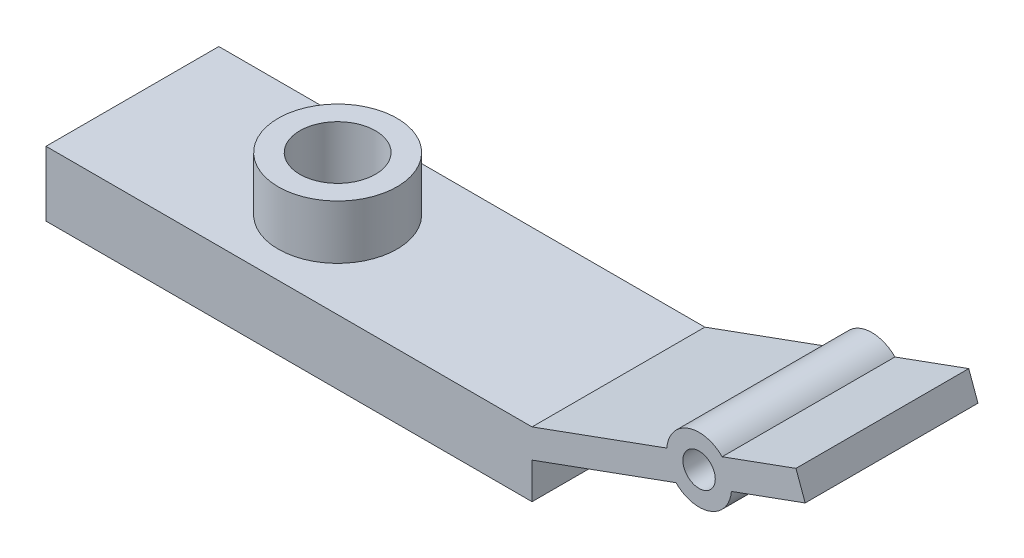
ISO-10303-21;
HEADER;
FILE_DESCRIPTION(('STEP AP214'),'2;1');
FILE_NAME('part.step','',(''),(''),'','','');
FILE_SCHEMA(('AUTOMOTIVE_DESIGN { 1 0 10303 214 1 1 1 1 }'));
ENDSEC;
DATA;
#1=APPLICATION_CONTEXT('core data for automotive mechanical design processes');
#2=APPLICATION_PROTOCOL_DEFINITION('international standard','automotive_design',2000,#1);
#3=PRODUCT_CONTEXT('',#1,'mechanical');
#4=PRODUCT('Part','Part','',(#3));
#5=PRODUCT_RELATED_PRODUCT_CATEGORY('part','',(#4));
#6=PRODUCT_DEFINITION_FORMATION('','',#4);
#7=PRODUCT_DEFINITION_CONTEXT('part definition',#1,'design');
#8=PRODUCT_DEFINITION('design','',#6,#7);
#9=PRODUCT_DEFINITION_SHAPE('','',#8);
#10=(LENGTH_UNIT() NAMED_UNIT(*) SI_UNIT(.MILLI.,.METRE.));
#11=(NAMED_UNIT(*) PLANE_ANGLE_UNIT() SI_UNIT($,.RADIAN.));
#12=(NAMED_UNIT(*) SI_UNIT($,.STERADIAN.) SOLID_ANGLE_UNIT());
#13=UNCERTAINTY_MEASURE_WITH_UNIT(LENGTH_MEASURE(1.E-05),#10,'distance_accuracy_value','');
#14=(GEOMETRIC_REPRESENTATION_CONTEXT(3) GLOBAL_UNCERTAINTY_ASSIGNED_CONTEXT((#13)) GLOBAL_UNIT_ASSIGNED_CONTEXT((#10,
#11,#12)) REPRESENTATION_CONTEXT('',''));
#15=CARTESIAN_POINT('',(0.,0.,0.));
#16=DIRECTION('',(0.,0.,1.));
#17=DIRECTION('',(1.,0.,0.));
#18=AXIS2_PLACEMENT_3D('',#15,#16,#17);
#19=CARTESIAN_POINT('',(120.925214223463,20.5954130344567,32.));
#20=DIRECTION('',(0.,0.,-1.));
#21=DIRECTION('',(-1.,0.,0.));
#22=AXIS2_PLACEMENT_3D('',#19,#20,#21);
#23=CYLINDRICAL_SURFACE('',#22,6.00000000000001);
#24=CARTESIAN_POINT('',(120.925214223463,20.5954130344567,0.));
#25=DIRECTION('',(0.,0.,1.));
#26=DIRECTION('',(1.,0.,0.));
#27=AXIS2_PLACEMENT_3D('',#24,#25,#26);
#28=CIRCLE('',#27,6.00000000000001);
#29=CARTESIAN_POINT('',(116.654846443577,16.3806818420188,0.));
#30=VERTEX_POINT('',#29);
#31=CARTESIAN_POINT('',(126.905682719978,20.111681122965,0.));
#32=VERTEX_POINT('',#31);
#33=EDGE_CURVE('E152',#30,#32,#28,.T.);
#34=ORIENTED_EDGE('',*,*,#33,.T.);
#35=DIRECTION('',(0.,0.,-1.));
#36=VECTOR('',#35,1.);
#37=CARTESIAN_POINT('',(126.905682719978,20.111681122965,32.));
#38=LINE('',#37,#36);
#39=CARTESIAN_POINT('',(126.905682719978,20.111681122965,32.));
#40=VERTEX_POINT('',#39);
#41=EDGE_CURVE('E11',#40,#32,#38,.T.);
#42=ORIENTED_EDGE('',*,*,#41,.F.);
#43=CARTESIAN_POINT('',(120.925214223463,20.5954130344567,32.));
#44=DIRECTION('',(0.,0.,1.));
#45=DIRECTION('',(1.,0.,0.));
#46=AXIS2_PLACEMENT_3D('',#43,#44,#45);
#47=CIRCLE('',#46,6.00000000000001);
#48=CARTESIAN_POINT('',(116.654846443577,16.3806818420188,32.));
#49=VERTEX_POINT('',#48);
#50=EDGE_CURVE('E99',#49,#40,#47,.T.);
#51=ORIENTED_EDGE('',*,*,#50,.F.);
#52=DIRECTION('',(0.,0.,-1.));
#53=VECTOR('',#52,1.);
#54=CARTESIAN_POINT('',(116.654846443577,16.3806818420188,32.));
#55=LINE('',#54,#53);
#56=EDGE_CURVE('E52',#49,#30,#55,.T.);
#57=ORIENTED_EDGE('',*,*,#56,.T.);
#58=EDGE_LOOP('',(#34,#42,#51,#57));
#59=FACE_BOUND('',#58,.T.);
#60=ADVANCED_FACE('F35',(#59),#23,.T.);
#61=CARTESIAN_POINT('',(8.38137511815517,-23.0276388811101,32.));
#62=DIRECTION('',(0.34202014332567,-0.939692620785908,0.));
#63=DIRECTION('',(0.939692620785908,0.34202014332567,0.));
#64=AXIS2_PLACEMENT_3D('',#61,#62,#63);
#65=PLANE('',#64);
#66=DIRECTION('',(-0.939692620785908,-0.34202014332567,0.));
#67=VECTOR('',#66,1.);
#68=CARTESIAN_POINT('',(8.38137511815517,-23.0276388811101,0.));
#69=LINE('',#68,#67);
#70=CARTESIAN_POINT('',(140.574116997496,25.0865843490053,0.));
#71=VERTEX_POINT('',#70);
#72=EDGE_CURVE('E155',#71,#32,#69,.T.);
#73=ORIENTED_EDGE('',*,*,#72,.F.);
#74=DIRECTION('',(0.,0.,-1.));
#75=VECTOR('',#74,1.);
#76=CARTESIAN_POINT('',(140.574116997496,25.0865843490053,32.));
#77=LINE('',#76,#75);
#78=CARTESIAN_POINT('',(140.574116997496,25.0865843490053,32.));
#79=VERTEX_POINT('',#78);
#80=EDGE_CURVE('E44',#79,#71,#77,.T.);
#81=ORIENTED_EDGE('',*,*,#80,.F.);
#82=DIRECTION('',(-0.939692620785908,-0.34202014332567,0.));
#83=VECTOR('',#82,1.);
#84=CARTESIAN_POINT('',(8.38137511815517,-23.0276388811101,32.));
#85=LINE('',#84,#83);
#86=EDGE_CURVE('E214',#79,#40,#85,.T.);
#87=ORIENTED_EDGE('',*,*,#86,.T.);
#88=ORIENTED_EDGE('',*,*,#41,.T.);
#89=EDGE_LOOP('',(#73,#81,#87,#88));
#90=FACE_BOUND('',#89,.T.);
#91=ADVANCED_FACE('F202',(#90),#65,.T.);
#92=CARTESIAN_POINT('',(132.19274187934,48.1142232301155,32.));
#93=DIRECTION('',(0.939692620785907,0.342020143325672,0.));
#94=DIRECTION('',(-0.342020143325672,0.939692620785907,0.));
#95=AXIS2_PLACEMENT_3D('',#92,#93,#94);
#96=PLANE('',#95);
#97=DIRECTION('',(0.342020143325672,-0.939692620785907,0.));
#98=VECTOR('',#97,1.);
#99=CARTESIAN_POINT('',(132.19274187934,48.1142232301155,0.));
#100=LINE('',#99,#98);
#101=CARTESIAN_POINT('',(138.864016280867,29.7850474529348,0.));
#102=VERTEX_POINT('',#101);
#103=EDGE_CURVE('E159',#102,#71,#100,.T.);
#104=ORIENTED_EDGE('',*,*,#103,.F.);
#105=DIRECTION('',(0.,0.,-1.));
#106=VECTOR('',#105,1.);
#107=CARTESIAN_POINT('',(138.864016280867,29.7850474529348,32.));
#108=LINE('',#107,#106);
#109=CARTESIAN_POINT('',(138.864016280867,29.7850474529348,32.));
#110=VERTEX_POINT('',#109);
#111=EDGE_CURVE('E192',#110,#102,#108,.T.);
#112=ORIENTED_EDGE('',*,*,#111,.F.);
#113=DIRECTION('',(0.342020143325672,-0.939692620785907,0.));
#114=VECTOR('',#113,1.);
#115=CARTESIAN_POINT('',(132.19274187934,48.1142232301155,32.));
#116=LINE('',#115,#114);
#117=EDGE_CURVE('E199',#110,#79,#116,.T.);
#118=ORIENTED_EDGE('',*,*,#117,.T.);
#119=ORIENTED_EDGE('',*,*,#80,.T.);
#120=EDGE_LOOP('',(#104,#112,#118,#119));
#121=FACE_BOUND('',#120,.T.);
#122=ADVANCED_FACE('F197',(#121),#96,.T.);
#123=CARTESIAN_POINT('',(6.67127440152713,-18.3291757771811,32.));
#124=DIRECTION('',(-0.342020143325674,0.939692620785907,0.));
#125=DIRECTION('',(-0.939692620785907,-0.342020143325674,0.));
#126=AXIS2_PLACEMENT_3D('',#123,#124,#125);
#127=PLANE('',#126);
#128=DIRECTION('',(0.939692620785906,0.342020143325674,0.));
#129=VECTOR('',#128,1.);
#130=CARTESIAN_POINT('',(6.67127440152713,-18.3291757771811,0.));
#131=LINE('',#130,#129);
#132=CARTESIAN_POINT('',(125.19558200335,24.8101442268945,0.));
#133=VERTEX_POINT('',#132);
#134=EDGE_CURVE('E162',#133,#102,#131,.T.);
#135=ORIENTED_EDGE('',*,*,#134,.F.);
#136=DIRECTION('',(0.,0.,-1.));
#137=VECTOR('',#136,1.);
#138=CARTESIAN_POINT('',(125.19558200335,24.8101442268945,32.));
#139=LINE('',#138,#137);
#140=CARTESIAN_POINT('',(125.19558200335,24.8101442268945,32.));
#141=VERTEX_POINT('',#140);
#142=EDGE_CURVE('E190',#141,#133,#139,.T.);
#143=ORIENTED_EDGE('',*,*,#142,.F.);
#144=DIRECTION('',(0.939692620785906,0.342020143325674,0.));
#145=VECTOR('',#144,1.);
#146=CARTESIAN_POINT('',(6.67127440152713,-18.3291757771811,32.));
#147=LINE('',#146,#145);
#148=EDGE_CURVE('E213',#141,#110,#147,.T.);
#149=ORIENTED_EDGE('',*,*,#148,.T.);
#150=ORIENTED_EDGE('',*,*,#111,.T.);
#151=EDGE_LOOP('',(#135,#143,#149,#150));
#152=FACE_BOUND('',#151,.T.);
#153=ADVANCED_FACE('F209',(#152),#127,.T.);
#154=CARTESIAN_POINT('',(114.944745726949,21.0791449459483,0.));
#155=VERTEX_POINT('',#154);
#156=EDGE_CURVE('E156',#133,#155,#28,.T.);
#157=ORIENTED_EDGE('',*,*,#156,.T.);
#158=DIRECTION('',(0.,0.,-1.));
#159=VECTOR('',#158,1.);
#160=CARTESIAN_POINT('',(114.944745726949,21.0791449459483,32.));
#161=LINE('',#160,#159);
#162=CARTESIAN_POINT('',(114.944745726949,21.0791449459483,32.));
#163=VERTEX_POINT('',#162);
#164=EDGE_CURVE('E188',#163,#155,#161,.T.);
#165=ORIENTED_EDGE('',*,*,#164,.F.);
#166=EDGE_CURVE('E216',#141,#163,#47,.T.);
#167=ORIENTED_EDGE('',*,*,#166,.F.);
#168=ORIENTED_EDGE('',*,*,#142,.T.);
#169=EDGE_LOOP('',(#157,#165,#167,#168));
#170=FACE_BOUND('',#169,.T.);
#171=ADVANCED_FACE('F244',(#170),#23,.T.);
#172=CARTESIAN_POINT('',(6.6712744015268,-18.3291757771805,32.));
#173=DIRECTION('',(-0.34202014332567,0.939692620785908,0.));
#174=DIRECTION('',(-0.939692620785908,-0.34202014332567,0.));
#175=AXIS2_PLACEMENT_3D('',#172,#173,#174);
#176=PLANE('',#175);
#177=DIRECTION('',(0.939692620785908,0.34202014332567,0.));
#178=VECTOR('',#177,1.);
#179=CARTESIAN_POINT('',(6.6712744015268,-18.3291757771805,0.));
#180=LINE('',#179,#178);
#181=CARTESIAN_POINT('',(90.,12.,0.));
#182=VERTEX_POINT('',#181);
#183=EDGE_CURVE('E165',#182,#155,#180,.T.);
#184=ORIENTED_EDGE('',*,*,#183,.F.);
#185=DIRECTION('',(0.,0.,-1.));
#186=VECTOR('',#185,1.);
#187=CARTESIAN_POINT('',(90.,12.,32.));
#188=LINE('',#187,#186);
#189=CARTESIAN_POINT('',(90.,12.,32.));
#190=VERTEX_POINT('',#189);
#191=EDGE_CURVE('E186',#190,#182,#188,.T.);
#192=ORIENTED_EDGE('',*,*,#191,.F.);
#193=DIRECTION('',(0.939692620785908,0.34202014332567,0.));
#194=VECTOR('',#193,1.);
#195=CARTESIAN_POINT('',(6.6712744015268,-18.3291757771805,32.));
#196=LINE('',#195,#194);
#197=EDGE_CURVE('E221',#190,#163,#196,.T.);
#198=ORIENTED_EDGE('',*,*,#197,.T.);
#199=ORIENTED_EDGE('',*,*,#164,.T.);
#200=EDGE_LOOP('',(#184,#192,#198,#199));
#201=FACE_BOUND('',#200,.T.);
#202=ADVANCED_FACE('F251',(#201),#176,.T.);
#203=CARTESIAN_POINT('',(0.,12.,32.));
#204=DIRECTION('',(0.,1.,0.));
#205=DIRECTION('',(0.,0.,1.));
#206=AXIS2_PLACEMENT_3D('',#203,#204,#205);
#207=PLANE('',#206);
#208=CARTESIAN_POINT('',(38.,12.,16.));
#209=DIRECTION('',(0.,1.,0.));
#210=DIRECTION('',(0.,0.,1.));
#211=AXIS2_PLACEMENT_3D('',#208,#209,#210);
#212=CIRCLE('',#211,11.);
#213=CARTESIAN_POINT('',(38.,12.,27.));
#214=VERTEX_POINT('',#213);
#215=EDGE_CURVE('E358',#214,#214,#212,.T.);
#216=ORIENTED_EDGE('',*,*,#215,.F.);
#217=EDGE_LOOP('',(#216));
#218=FACE_BOUND('',#217,.T.);
#219=DIRECTION('',(1.,0.,0.));
#220=VECTOR('',#219,1.);
#221=CARTESIAN_POINT('',(0.,12.,0.));
#222=LINE('',#221,#220);
#223=CARTESIAN_POINT('',(0.,12.,0.));
#224=VERTEX_POINT('',#223);
#225=EDGE_CURVE('E168',#224,#182,#222,.T.);
#226=ORIENTED_EDGE('',*,*,#225,.F.);
#227=DIRECTION('',(0.,0.,-1.));
#228=VECTOR('',#227,1.);
#229=CARTESIAN_POINT('',(0.,12.,32.));
#230=LINE('',#229,#228);
#231=CARTESIAN_POINT('',(0.,12.,32.));
#232=VERTEX_POINT('',#231);
#233=EDGE_CURVE('E184',#232,#224,#230,.T.);
#234=ORIENTED_EDGE('',*,*,#233,.F.);
#235=DIRECTION('',(1.,0.,0.));
#236=VECTOR('',#235,1.);
#237=CARTESIAN_POINT('',(0.,12.,32.));
#238=LINE('',#237,#236);
#239=EDGE_CURVE('E224',#232,#190,#238,.T.);
#240=ORIENTED_EDGE('',*,*,#239,.T.);
#241=ORIENTED_EDGE('',*,*,#191,.T.);
#242=EDGE_LOOP('',(#226,#234,#240,#241));
#243=FACE_BOUND('',#242,.T.);
#244=ADVANCED_FACE('F257',(#218,#243),#207,.T.);
#245=CARTESIAN_POINT('',(0.,0.,32.));
#246=DIRECTION('',(-1.,0.,0.));
#247=DIRECTION('',(0.,0.,1.));
#248=AXIS2_PLACEMENT_3D('',#245,#246,#247);
#249=PLANE('',#248);
#250=DIRECTION('',(0.,1.,0.));
#251=VECTOR('',#250,1.);
#252=CARTESIAN_POINT('',(0.,0.,0.));
#253=LINE('',#252,#251);
#254=CARTESIAN_POINT('',(0.,0.,0.));
#255=VERTEX_POINT('',#254);
#256=EDGE_CURVE('E171',#255,#224,#253,.T.);
#257=ORIENTED_EDGE('',*,*,#256,.F.);
#258=DIRECTION('',(0.,0.,-1.));
#259=VECTOR('',#258,1.);
#260=CARTESIAN_POINT('',(0.,0.,32.));
#261=LINE('',#260,#259);
#262=CARTESIAN_POINT('',(0.,0.,32.));
#263=VERTEX_POINT('',#262);
#264=EDGE_CURVE('E141',#263,#255,#261,.T.);
#265=ORIENTED_EDGE('',*,*,#264,.F.);
#266=DIRECTION('',(0.,1.,0.));
#267=VECTOR('',#266,1.);
#268=CARTESIAN_POINT('',(0.,0.,32.));
#269=LINE('',#268,#267);
#270=EDGE_CURVE('E131',#263,#232,#269,.T.);
#271=ORIENTED_EDGE('',*,*,#270,.T.);
#272=ORIENTED_EDGE('',*,*,#233,.T.);
#273=EDGE_LOOP('',(#257,#265,#271,#272));
#274=FACE_BOUND('',#273,.T.);
#275=ADVANCED_FACE('F228',(#274),#249,.T.);
#276=CARTESIAN_POINT('',(0.,0.,32.));
#277=DIRECTION('',(0.,1.,0.));
#278=DIRECTION('',(0.,0.,1.));
#279=AXIS2_PLACEMENT_3D('',#276,#277,#278);
#280=PLANE('',#279);
#281=CARTESIAN_POINT('',(38.,0.,16.));
#282=DIRECTION('',(0.,1.,0.));
#283=DIRECTION('',(0.,0.,1.));
#284=AXIS2_PLACEMENT_3D('',#281,#282,#283);
#285=CIRCLE('',#284,7.);
#286=CARTESIAN_POINT('',(38.,0.,23.));
#287=VERTEX_POINT('',#286);
#288=EDGE_CURVE('E357',#287,#287,#285,.T.);
#289=ORIENTED_EDGE('',*,*,#288,.T.);
#290=EDGE_LOOP('',(#289));
#291=FACE_BOUND('',#290,.T.);
#292=DIRECTION('',(1.,0.,0.));
#293=VECTOR('',#292,1.);
#294=CARTESIAN_POINT('',(0.,0.,0.));
#295=LINE('',#294,#293);
#296=CARTESIAN_POINT('',(90.,0.,0.));
#297=VERTEX_POINT('',#296);
#298=EDGE_CURVE('E138',#255,#297,#295,.T.);
#299=ORIENTED_EDGE('',*,*,#298,.T.);
#300=DIRECTION('',(0.,0.,-1.));
#301=VECTOR('',#300,1.);
#302=CARTESIAN_POINT('',(90.,0.,32.));
#303=LINE('',#302,#301);
#304=CARTESIAN_POINT('',(90.,0.,32.));
#305=VERTEX_POINT('',#304);
#306=EDGE_CURVE('E135',#305,#297,#303,.T.);
#307=ORIENTED_EDGE('',*,*,#306,.F.);
#308=DIRECTION('',(1.,0.,0.));
#309=VECTOR('',#308,1.);
#310=CARTESIAN_POINT('',(0.,0.,32.));
#311=LINE('',#310,#309);
#312=EDGE_CURVE('E124',#263,#305,#311,.T.);
#313=ORIENTED_EDGE('',*,*,#312,.F.);
#314=ORIENTED_EDGE('',*,*,#264,.T.);
#315=EDGE_LOOP('',(#299,#307,#313,#314));
#316=FACE_BOUND('',#315,.T.);
#317=ADVANCED_FACE('F136',(#291,#316),#280,.F.);
#318=CARTESIAN_POINT('',(90.,0.,32.));
#319=DIRECTION('',(-1.,0.,0.));
#320=DIRECTION('',(0.,0.,1.));
#321=AXIS2_PLACEMENT_3D('',#318,#319,#320);
#322=PLANE('',#321);
#323=DIRECTION('',(0.,1.,0.));
#324=VECTOR('',#323,1.);
#325=CARTESIAN_POINT('',(90.,0.,0.));
#326=LINE('',#325,#324);
#327=CARTESIAN_POINT('',(90.,6.67911113762043,0.));
#328=VERTEX_POINT('',#327);
#329=EDGE_CURVE('E175',#297,#328,#326,.T.);
#330=ORIENTED_EDGE('',*,*,#329,.T.);
#331=DIRECTION('',(0.,0.,-1.));
#332=VECTOR('',#331,1.);
#333=CARTESIAN_POINT('',(90.,6.67911113762043,32.));
#334=LINE('',#333,#332);
#335=CARTESIAN_POINT('',(90.,6.67911113762043,32.));
#336=VERTEX_POINT('',#335);
#337=EDGE_CURVE('E87',#336,#328,#334,.T.);
#338=ORIENTED_EDGE('',*,*,#337,.F.);
#339=DIRECTION('',(0.,1.,0.));
#340=VECTOR('',#339,1.);
#341=CARTESIAN_POINT('',(90.,0.,32.));
#342=LINE('',#341,#340);
#343=EDGE_CURVE('E128',#305,#336,#342,.T.);
#344=ORIENTED_EDGE('',*,*,#343,.F.);
#345=ORIENTED_EDGE('',*,*,#306,.T.);
#346=EDGE_LOOP('',(#330,#338,#344,#345));
#347=FACE_BOUND('',#346,.T.);
#348=ADVANCED_FACE('F143',(#347),#322,.F.);
#349=CARTESIAN_POINT('',(120.925214223463,20.5954130344567,32.));
#350=DIRECTION('',(0.,0.,-1.));
#351=DIRECTION('',(-1.,0.,0.));
#352=AXIS2_PLACEMENT_3D('',#349,#350,#351);
#353=CYLINDRICAL_SURFACE('',#352,3.00000000000001);
#354=CARTESIAN_POINT('',(120.925214223463,20.5954130344567,32.));
#355=DIRECTION('',(0.,0.,1.));
#356=DIRECTION('',(1.,0.,0.));
#357=AXIS2_PLACEMENT_3D('',#354,#355,#356);
#358=CIRCLE('',#357,3.00000000000001);
#359=CARTESIAN_POINT('',(123.925214223463,20.5954130344567,32.));
#360=VERTEX_POINT('',#359);
#361=EDGE_CURVE('E180',#360,#360,#358,.T.);
#362=ORIENTED_EDGE('',*,*,#361,.T.);
#363=EDGE_LOOP('',(#362));
#364=FACE_BOUND('',#363,.T.);
#365=CARTESIAN_POINT('',(120.925214223463,20.5954130344567,0.));
#366=DIRECTION('',(0.,0.,1.));
#367=DIRECTION('',(1.,0.,0.));
#368=AXIS2_PLACEMENT_3D('',#365,#366,#367);
#369=CIRCLE('',#368,3.00000000000001);
#370=CARTESIAN_POINT('',(123.925214223463,20.5954130344567,0.));
#371=VERTEX_POINT('',#370);
#372=EDGE_CURVE('E149',#371,#371,#369,.T.);
#373=ORIENTED_EDGE('',*,*,#372,.F.);
#374=EDGE_LOOP('',(#373));
#375=FACE_BOUND('',#374,.T.);
#376=ADVANCED_FACE('F37',(#364,#375),#353,.F.);
#377=CARTESIAN_POINT('',(8.38137511815513,-23.02763888111,32.));
#378=DIRECTION('',(0.342020143325669,-0.939692620785908,0.));
#379=DIRECTION('',(0.939692620785908,0.342020143325669,0.));
#380=AXIS2_PLACEMENT_3D('',#377,#378,#379);
#381=PLANE('',#380);
#382=DIRECTION('',(-0.939692620785908,-0.342020143325669,0.));
#383=VECTOR('',#382,1.);
#384=CARTESIAN_POINT('',(8.38137511815513,-23.02763888111,0.));
#385=LINE('',#384,#383);
#386=EDGE_CURVE('E177',#30,#328,#385,.T.);
#387=ORIENTED_EDGE('',*,*,#386,.F.);
#388=ORIENTED_EDGE('',*,*,#56,.F.);
#389=DIRECTION('',(-0.939692620785908,-0.342020143325669,0.));
#390=VECTOR('',#389,1.);
#391=CARTESIAN_POINT('',(8.38137511815513,-23.02763888111,32.));
#392=LINE('',#391,#390);
#393=EDGE_CURVE('E144',#49,#336,#392,.T.);
#394=ORIENTED_EDGE('',*,*,#393,.T.);
#395=ORIENTED_EDGE('',*,*,#337,.T.);
#396=EDGE_LOOP('',(#387,#388,#394,#395));
#397=FACE_BOUND('',#396,.T.);
#398=ADVANCED_FACE('F230',(#397),#381,.T.);
#399=CARTESIAN_POINT('',(0.,0.,32.));
#400=DIRECTION('',(0.,0.,1.));
#401=DIRECTION('',(1.,0.,0.));
#402=AXIS2_PLACEMENT_3D('',#399,#400,#401);
#403=PLANE('',#402);
#404=ORIENTED_EDGE('',*,*,#361,.F.);
#405=EDGE_LOOP('',(#404));
#406=FACE_BOUND('',#405,.T.);
#407=ORIENTED_EDGE('',*,*,#50,.T.);
#408=ORIENTED_EDGE('',*,*,#86,.F.);
#409=ORIENTED_EDGE('',*,*,#117,.F.);
#410=ORIENTED_EDGE('',*,*,#148,.F.);
#411=ORIENTED_EDGE('',*,*,#166,.T.);
#412=ORIENTED_EDGE('',*,*,#197,.F.);
#413=ORIENTED_EDGE('',*,*,#239,.F.);
#414=ORIENTED_EDGE('',*,*,#270,.F.);
#415=ORIENTED_EDGE('',*,*,#312,.T.);
#416=ORIENTED_EDGE('',*,*,#343,.T.);
#417=ORIENTED_EDGE('',*,*,#393,.F.);
#418=EDGE_LOOP('',(#407,#408,#409,#410,#411,#412,#413,#414,#415,#416,#417));
#419=FACE_BOUND('',#418,.T.);
#420=ADVANCED_FACE('F126',(#406,#419),#403,.T.);
#421=CARTESIAN_POINT('',(0.,0.,0.));
#422=DIRECTION('',(0.,0.,1.));
#423=DIRECTION('',(1.,0.,0.));
#424=AXIS2_PLACEMENT_3D('',#421,#422,#423);
#425=PLANE('',#424);
#426=ORIENTED_EDGE('',*,*,#372,.T.);
#427=EDGE_LOOP('',(#426));
#428=FACE_BOUND('',#427,.T.);
#429=ORIENTED_EDGE('',*,*,#33,.F.);
#430=ORIENTED_EDGE('',*,*,#386,.T.);
#431=ORIENTED_EDGE('',*,*,#329,.F.);
#432=ORIENTED_EDGE('',*,*,#298,.F.);
#433=ORIENTED_EDGE('',*,*,#256,.T.);
#434=ORIENTED_EDGE('',*,*,#225,.T.);
#435=ORIENTED_EDGE('',*,*,#183,.T.);
#436=ORIENTED_EDGE('',*,*,#156,.F.);
#437=ORIENTED_EDGE('',*,*,#134,.T.);
#438=ORIENTED_EDGE('',*,*,#103,.T.);
#439=ORIENTED_EDGE('',*,*,#72,.T.);
#440=EDGE_LOOP('',(#429,#430,#431,#432,#433,#434,#435,#436,#437,#438,#439));
#441=FACE_BOUND('',#440,.T.);
#442=ADVANCED_FACE('F204',(#428,#441),#425,.F.);
#443=CARTESIAN_POINT('',(38.,22.,16.));
#444=DIRECTION('',(0.,-1.,0.));
#445=DIRECTION('',(0.,0.,-1.));
#446=AXIS2_PLACEMENT_3D('',#443,#444,#445);
#447=CYLINDRICAL_SURFACE('',#446,7.);
#448=CARTESIAN_POINT('',(38.,22.,16.));
#449=DIRECTION('',(0.,1.,0.));
#450=DIRECTION('',(0.,0.,1.));
#451=AXIS2_PLACEMENT_3D('',#448,#449,#450);
#452=CIRCLE('',#451,7.);
#453=CARTESIAN_POINT('',(38.,22.,23.));
#454=VERTEX_POINT('',#453);
#455=EDGE_CURVE('E354',#454,#454,#452,.T.);
#456=ORIENTED_EDGE('',*,*,#455,.T.);
#457=EDGE_LOOP('',(#456));
#458=FACE_BOUND('',#457,.T.);
#459=ORIENTED_EDGE('',*,*,#288,.F.);
#460=EDGE_LOOP('',(#459));
#461=FACE_BOUND('',#460,.T.);
#462=ADVANCED_FACE('F304',(#458,#461),#447,.F.);
#463=CARTESIAN_POINT('',(38.,22.,16.));
#464=DIRECTION('',(0.,-1.,0.));
#465=DIRECTION('',(0.,0.,-1.));
#466=AXIS2_PLACEMENT_3D('',#463,#464,#465);
#467=CYLINDRICAL_SURFACE('',#466,11.);
#468=CARTESIAN_POINT('',(38.,22.,16.));
#469=DIRECTION('',(0.,1.,0.));
#470=DIRECTION('',(0.,0.,1.));
#471=AXIS2_PLACEMENT_3D('',#468,#469,#470);
#472=CIRCLE('',#471,11.);
#473=CARTESIAN_POINT('',(38.,22.,27.));
#474=VERTEX_POINT('',#473);
#475=EDGE_CURVE('E153',#474,#474,#472,.T.);
#476=ORIENTED_EDGE('',*,*,#475,.F.);
#477=EDGE_LOOP('',(#476));
#478=FACE_BOUND('',#477,.T.);
#479=ORIENTED_EDGE('',*,*,#215,.T.);
#480=EDGE_LOOP('',(#479));
#481=FACE_BOUND('',#480,.T.);
#482=ADVANCED_FACE('F318',(#478,#481),#467,.T.);
#483=CARTESIAN_POINT('',(0.,22.,0.));
#484=DIRECTION('',(0.,1.,0.));
#485=DIRECTION('',(0.,0.,1.));
#486=AXIS2_PLACEMENT_3D('',#483,#484,#485);
#487=PLANE('',#486);
#488=ORIENTED_EDGE('',*,*,#455,.F.);
#489=EDGE_LOOP('',(#488));
#490=FACE_BOUND('',#489,.T.);
#491=ORIENTED_EDGE('',*,*,#475,.T.);
#492=EDGE_LOOP('',(#491));
#493=FACE_BOUND('',#492,.T.);
#494=ADVANCED_FACE('F323',(#490,#493),#487,.T.);
#495=CLOSED_SHELL('',(#60,#91,#122,#153,#171,#202,#244,#275,#317,#348,#376,#398,#420,#442,#462,
#482,#494));
#496=MANIFOLD_SOLID_BREP('B2',#495);
#497=ADVANCED_BREP_SHAPE_REPRESENTATION('',(#18,#496),#14);
#498=SHAPE_DEFINITION_REPRESENTATION(#9,#497);
ENDSEC;
END-ISO-10303-21;
